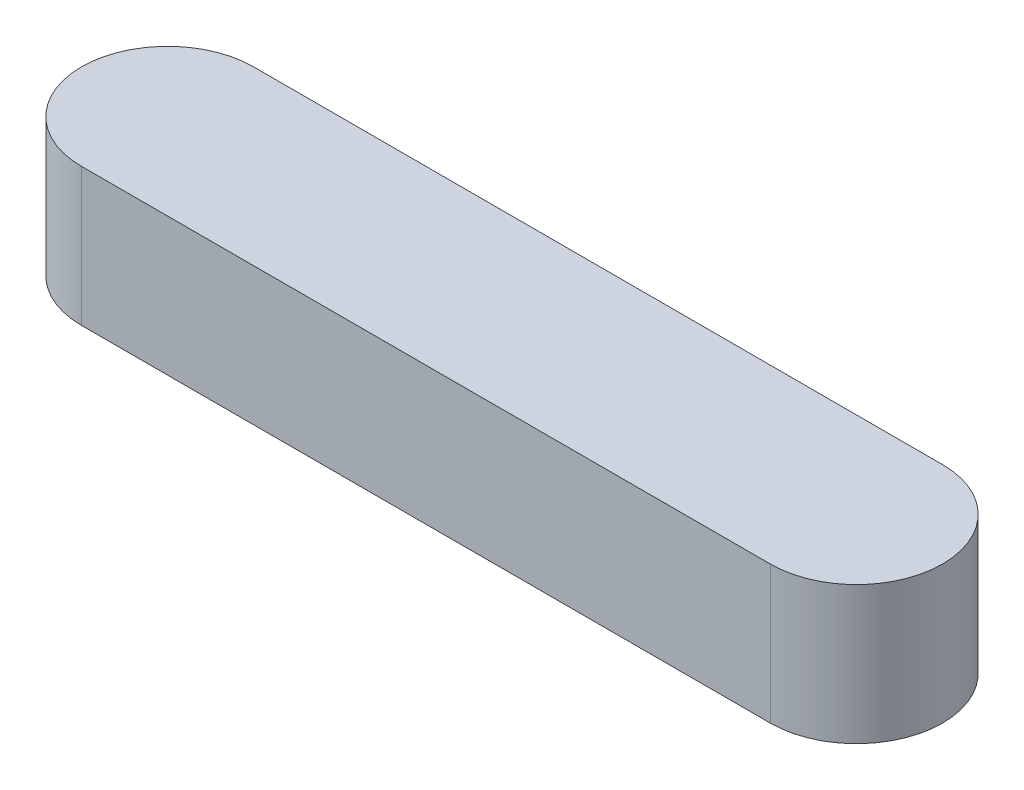
ISO-10303-21;
HEADER;
FILE_DESCRIPTION(('STEP AP214'),'2;1');
FILE_NAME('part.step','',(''),(''),'','','');
FILE_SCHEMA(('AUTOMOTIVE_DESIGN { 1 0 10303 214 1 1 1 1 }'));
ENDSEC;
DATA;
#1=APPLICATION_CONTEXT('core data for automotive mechanical design processes');
#2=APPLICATION_PROTOCOL_DEFINITION('international standard','automotive_design',2000,#1);
#3=PRODUCT_CONTEXT('',#1,'mechanical');
#4=PRODUCT('Part','Part','',(#3));
#5=PRODUCT_RELATED_PRODUCT_CATEGORY('part','',(#4));
#6=PRODUCT_DEFINITION_FORMATION('','',#4);
#7=PRODUCT_DEFINITION_CONTEXT('part definition',#1,'design');
#8=PRODUCT_DEFINITION('design','',#6,#7);
#9=PRODUCT_DEFINITION_SHAPE('','',#8);
#10=(LENGTH_UNIT() NAMED_UNIT(*) SI_UNIT(.MILLI.,.METRE.));
#11=(NAMED_UNIT(*) PLANE_ANGLE_UNIT() SI_UNIT($,.RADIAN.));
#12=(NAMED_UNIT(*) SI_UNIT($,.STERADIAN.) SOLID_ANGLE_UNIT());
#13=UNCERTAINTY_MEASURE_WITH_UNIT(LENGTH_MEASURE(1.E-05),#10,'distance_accuracy_value','');
#14=(GEOMETRIC_REPRESENTATION_CONTEXT(3) GLOBAL_UNCERTAINTY_ASSIGNED_CONTEXT((#13)) GLOBAL_UNIT_ASSIGNED_CONTEXT((#10,
#11,#12)) REPRESENTATION_CONTEXT('',''));
#15=CARTESIAN_POINT('',(0.,0.,0.));
#16=DIRECTION('',(0.,0.,1.));
#17=DIRECTION('',(1.,0.,0.));
#18=AXIS2_PLACEMENT_3D('',#15,#16,#17);
#19=CARTESIAN_POINT('',(-20.,8.,0.));
#20=DIRECTION('',(0.,-1.,0.));
#21=DIRECTION('',(0.,0.,-1.));
#22=AXIS2_PLACEMENT_3D('',#19,#20,#21);
#23=CYLINDRICAL_SURFACE('',#22,5.);
#24=CARTESIAN_POINT('',(-20.,0.,0.));
#25=DIRECTION('',(0.,1.,0.));
#26=DIRECTION('',(0.,0.,1.));
#27=AXIS2_PLACEMENT_3D('',#24,#25,#26);
#28=CIRCLE('',#27,5.);
#29=CARTESIAN_POINT('',(-20.,0.,-5.));
#30=VERTEX_POINT('',#29);
#31=CARTESIAN_POINT('',(-20.,0.,5.));
#32=VERTEX_POINT('',#31);
#33=EDGE_CURVE('E104',#30,#32,#28,.T.);
#34=ORIENTED_EDGE('',*,*,#33,.T.);
#35=DIRECTION('',(0.,-1.,0.));
#36=VECTOR('',#35,1.);
#37=CARTESIAN_POINT('',(-20.,8.,5.));
#38=LINE('',#37,#36);
#39=CARTESIAN_POINT('',(-20.,8.,5.));
#40=VERTEX_POINT('',#39);
#41=EDGE_CURVE('E11',#40,#32,#38,.T.);
#42=ORIENTED_EDGE('',*,*,#41,.F.);
#43=CARTESIAN_POINT('',(-20.,8.,0.));
#44=DIRECTION('',(0.,1.,0.));
#45=DIRECTION('',(0.,0.,1.));
#46=AXIS2_PLACEMENT_3D('',#43,#44,#45);
#47=CIRCLE('',#46,5.);
#48=CARTESIAN_POINT('',(-20.,8.,-5.));
#49=VERTEX_POINT('',#48);
#50=EDGE_CURVE('E92',#49,#40,#47,.T.);
#51=ORIENTED_EDGE('',*,*,#50,.F.);
#52=DIRECTION('',(0.,-1.,0.));
#53=VECTOR('',#52,1.);
#54=CARTESIAN_POINT('',(-20.,8.,-5.));
#55=LINE('',#54,#53);
#56=EDGE_CURVE('E100',#49,#30,#55,.T.);
#57=ORIENTED_EDGE('',*,*,#56,.T.);
#58=EDGE_LOOP('',(#34,#42,#51,#57));
#59=FACE_BOUND('',#58,.T.);
#60=ADVANCED_FACE('F41',(#59),#23,.T.);
#61=CARTESIAN_POINT('',(-20.,8.,5.));
#62=DIRECTION('',(0.,0.,-1.));
#63=DIRECTION('',(-1.,0.,0.));
#64=AXIS2_PLACEMENT_3D('',#61,#62,#63);
#65=PLANE('',#64);
#66=DIRECTION('',(1.,0.,0.));
#67=VECTOR('',#66,1.);
#68=CARTESIAN_POINT('',(-20.,0.,5.));
#69=LINE('',#68,#67);
#70=CARTESIAN_POINT('',(20.,0.,5.));
#71=VERTEX_POINT('',#70);
#72=EDGE_CURVE('E96',#32,#71,#69,.T.);
#73=ORIENTED_EDGE('',*,*,#72,.T.);
#74=DIRECTION('',(0.,-1.,0.));
#75=VECTOR('',#74,1.);
#76=CARTESIAN_POINT('',(20.,8.,5.));
#77=LINE('',#76,#75);
#78=CARTESIAN_POINT('',(20.,8.,5.));
#79=VERTEX_POINT('',#78);
#80=EDGE_CURVE('E49',#79,#71,#77,.T.);
#81=ORIENTED_EDGE('',*,*,#80,.F.);
#82=DIRECTION('',(1.,0.,0.));
#83=VECTOR('',#82,1.);
#84=CARTESIAN_POINT('',(-20.,8.,5.));
#85=LINE('',#84,#83);
#86=EDGE_CURVE('E87',#40,#79,#85,.T.);
#87=ORIENTED_EDGE('',*,*,#86,.F.);
#88=ORIENTED_EDGE('',*,*,#41,.T.);
#89=EDGE_LOOP('',(#73,#81,#87,#88));
#90=FACE_BOUND('',#89,.T.);
#91=ADVANCED_FACE('F95',(#90),#65,.F.);
#92=CARTESIAN_POINT('',(20.,8.,0.));
#93=DIRECTION('',(0.,-1.,0.));
#94=DIRECTION('',(0.,0.,-1.));
#95=AXIS2_PLACEMENT_3D('',#92,#93,#94);
#96=CYLINDRICAL_SURFACE('',#95,5.);
#97=CARTESIAN_POINT('',(20.,0.,0.));
#98=DIRECTION('',(0.,1.,0.));
#99=DIRECTION('',(0.,0.,1.));
#100=AXIS2_PLACEMENT_3D('',#97,#98,#99);
#101=CIRCLE('',#100,5.);
#102=CARTESIAN_POINT('',(20.,0.,-5.));
#103=VERTEX_POINT('',#102);
#104=EDGE_CURVE('E74',#71,#103,#101,.T.);
#105=ORIENTED_EDGE('',*,*,#104,.T.);
#106=DIRECTION('',(0.,-1.,0.));
#107=VECTOR('',#106,1.);
#108=CARTESIAN_POINT('',(20.,8.,-5.));
#109=LINE('',#108,#107);
#110=CARTESIAN_POINT('',(20.,8.,-5.));
#111=VERTEX_POINT('',#110);
#112=EDGE_CURVE('E97',#111,#103,#109,.T.);
#113=ORIENTED_EDGE('',*,*,#112,.F.);
#114=CARTESIAN_POINT('',(20.,8.,0.));
#115=DIRECTION('',(0.,1.,0.));
#116=DIRECTION('',(0.,0.,1.));
#117=AXIS2_PLACEMENT_3D('',#114,#115,#116);
#118=CIRCLE('',#117,5.);
#119=EDGE_CURVE('E90',#79,#111,#118,.T.);
#120=ORIENTED_EDGE('',*,*,#119,.F.);
#121=ORIENTED_EDGE('',*,*,#80,.T.);
#122=EDGE_LOOP('',(#105,#113,#120,#121));
#123=FACE_BOUND('',#122,.T.);
#124=ADVANCED_FACE('F98',(#123),#96,.T.);
#125=CARTESIAN_POINT('',(-20.,8.,-5.));
#126=DIRECTION('',(0.,0.,1.));
#127=DIRECTION('',(1.,0.,0.));
#128=AXIS2_PLACEMENT_3D('',#125,#126,#127);
#129=PLANE('',#128);
#130=DIRECTION('',(-1.,0.,0.));
#131=VECTOR('',#130,1.);
#132=CARTESIAN_POINT('',(-20.,0.,-5.));
#133=LINE('',#132,#131);
#134=EDGE_CURVE('E80',#103,#30,#133,.T.);
#135=ORIENTED_EDGE('',*,*,#134,.T.);
#136=ORIENTED_EDGE('',*,*,#56,.F.);
#137=DIRECTION('',(-1.,0.,0.));
#138=VECTOR('',#137,1.);
#139=CARTESIAN_POINT('',(-20.,8.,-5.));
#140=LINE('',#139,#138);
#141=EDGE_CURVE('E57',#111,#49,#140,.T.);
#142=ORIENTED_EDGE('',*,*,#141,.F.);
#143=ORIENTED_EDGE('',*,*,#112,.T.);
#144=EDGE_LOOP('',(#135,#136,#142,#143));
#145=FACE_BOUND('',#144,.T.);
#146=ADVANCED_FACE('F111',(#145),#129,.F.);
#147=CARTESIAN_POINT('',(-20.,8.,0.));
#148=DIRECTION('',(0.,1.,0.));
#149=DIRECTION('',(0.,0.,1.));
#150=AXIS2_PLACEMENT_3D('',#147,#148,#149);
#151=PLANE('',#150);
#152=ORIENTED_EDGE('',*,*,#50,.T.);
#153=ORIENTED_EDGE('',*,*,#86,.T.);
#154=ORIENTED_EDGE('',*,*,#119,.T.);
#155=ORIENTED_EDGE('',*,*,#141,.T.);
#156=EDGE_LOOP('',(#152,#153,#154,#155));
#157=FACE_BOUND('',#156,.T.);
#158=ADVANCED_FACE('F88',(#157),#151,.T.);
#159=CARTESIAN_POINT('',(-20.,0.,0.));
#160=DIRECTION('',(0.,1.,0.));
#161=DIRECTION('',(0.,0.,1.));
#162=AXIS2_PLACEMENT_3D('',#159,#160,#161);
#163=PLANE('',#162);
#164=ORIENTED_EDGE('',*,*,#33,.F.);
#165=ORIENTED_EDGE('',*,*,#134,.F.);
#166=ORIENTED_EDGE('',*,*,#104,.F.);
#167=ORIENTED_EDGE('',*,*,#72,.F.);
#168=EDGE_LOOP('',(#164,#165,#166,#167));
#169=FACE_BOUND('',#168,.T.);
#170=ADVANCED_FACE('F114',(#169),#163,.F.);
#171=CLOSED_SHELL('',(#60,#91,#124,#146,#158,#170));
#172=MANIFOLD_SOLID_BREP('B2',#171);
#173=ADVANCED_BREP_SHAPE_REPRESENTATION('',(#18,#172),#14);
#174=SHAPE_DEFINITION_REPRESENTATION(#9,#173);
ENDSEC;
END-ISO-10303-21;
